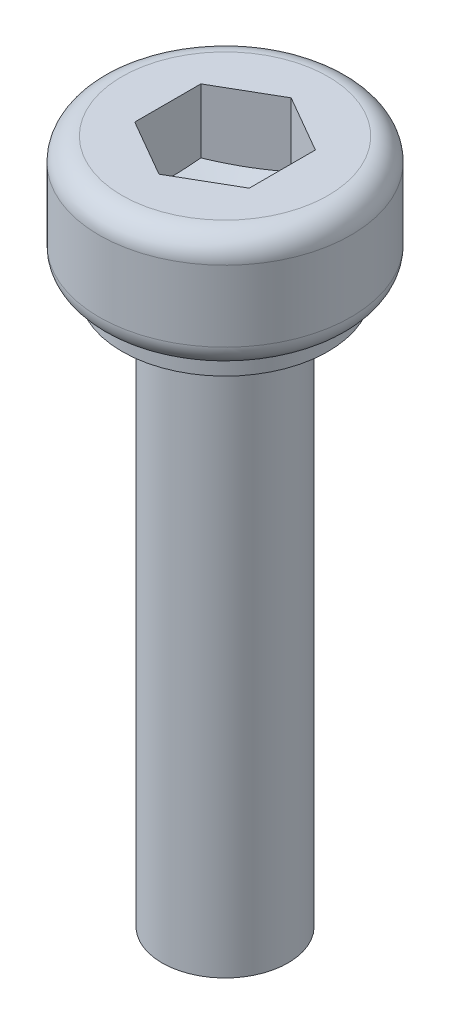
ISO-10303-21;
HEADER;
FILE_DESCRIPTION(('STEP AP214'),'2;1');
FILE_NAME('part.step','',(''),(''),'','','');
FILE_SCHEMA(('AUTOMOTIVE_DESIGN { 1 0 10303 214 1 1 1 1 }'));
ENDSEC;
DATA;
#1=APPLICATION_CONTEXT('core data for automotive mechanical design processes');
#2=APPLICATION_PROTOCOL_DEFINITION('international standard','automotive_design',2000,#1);
#3=PRODUCT_CONTEXT('',#1,'mechanical');
#4=PRODUCT('Part','Part','',(#3));
#5=PRODUCT_RELATED_PRODUCT_CATEGORY('part','',(#4));
#6=PRODUCT_DEFINITION_FORMATION('','',#4);
#7=PRODUCT_DEFINITION_CONTEXT('part definition',#1,'design');
#8=PRODUCT_DEFINITION('design','',#6,#7);
#9=PRODUCT_DEFINITION_SHAPE('','',#8);
#10=(LENGTH_UNIT() NAMED_UNIT(*) SI_UNIT(.MILLI.,.METRE.));
#11=(NAMED_UNIT(*) PLANE_ANGLE_UNIT() SI_UNIT($,.RADIAN.));
#12=(NAMED_UNIT(*) SI_UNIT($,.STERADIAN.) SOLID_ANGLE_UNIT());
#13=UNCERTAINTY_MEASURE_WITH_UNIT(LENGTH_MEASURE(1.E-05),#10,'distance_accuracy_value','');
#14=(GEOMETRIC_REPRESENTATION_CONTEXT(3) GLOBAL_UNCERTAINTY_ASSIGNED_CONTEXT((#13)) GLOBAL_UNIT_ASSIGNED_CONTEXT((#10,
#11,#12)) REPRESENTATION_CONTEXT('',''));
#15=CARTESIAN_POINT('',(0.,0.,0.));
#16=DIRECTION('',(0.,0.,1.));
#17=DIRECTION('',(1.,0.,0.));
#18=AXIS2_PLACEMENT_3D('',#15,#16,#17);
#19=CARTESIAN_POINT('',(0.,7.475,0.));
#20=DIRECTION('',(0.,-1.,0.));
#21=DIRECTION('',(0.,0.,-1.));
#22=AXIS2_PLACEMENT_3D('',#19,#20,#21);
#23=PLANE('',#22);
#24=DIRECTION('',(-0.866025403784439,0.,0.5));
#25=VECTOR('',#24,1.);
#26=CARTESIAN_POINT('',(0.,7.475,-1.44337567297406));
#27=LINE('',#26,#25);
#28=CARTESIAN_POINT('',(0.,7.475,-1.44337567297406));
#29=VERTEX_POINT('',#28);
#30=CARTESIAN_POINT('',(-1.25,7.475,-0.721687836487033));
#31=VERTEX_POINT('',#30);
#32=EDGE_CURVE('E215',#29,#31,#27,.T.);
#33=ORIENTED_EDGE('',*,*,#32,.F.);
#34=DIRECTION('',(-0.866025403784439,0.,-0.5));
#35=VECTOR('',#34,1.);
#36=CARTESIAN_POINT('',(1.25,7.475,-0.721687836487033));
#37=LINE('',#36,#35);
#38=CARTESIAN_POINT('',(1.25,7.475,-0.721687836487033));
#39=VERTEX_POINT('',#38);
#40=EDGE_CURVE('E64',#39,#29,#37,.T.);
#41=ORIENTED_EDGE('',*,*,#40,.F.);
#42=DIRECTION('',(0.,0.,-1.));
#43=VECTOR('',#42,1.);
#44=CARTESIAN_POINT('',(1.25,7.475,0.721687836487033));
#45=LINE('',#44,#43);
#46=CARTESIAN_POINT('',(1.25,7.475,0.721687836487033));
#47=VERTEX_POINT('',#46);
#48=EDGE_CURVE('E126',#47,#39,#45,.T.);
#49=ORIENTED_EDGE('',*,*,#48,.F.);
#50=DIRECTION('',(0.866025403784439,0.,-0.5));
#51=VECTOR('',#50,1.);
#52=CARTESIAN_POINT('',(0.,7.475,1.44337567297406));
#53=LINE('',#52,#51);
#54=CARTESIAN_POINT('',(0.,7.475,1.44337567297406));
#55=VERTEX_POINT('',#54);
#56=EDGE_CURVE('E133',#55,#47,#53,.T.);
#57=ORIENTED_EDGE('',*,*,#56,.F.);
#58=DIRECTION('',(0.866025403784439,0.,0.5));
#59=VECTOR('',#58,1.);
#60=CARTESIAN_POINT('',(-1.25,7.475,0.721687836487033));
#61=LINE('',#60,#59);
#62=CARTESIAN_POINT('',(-1.25,7.475,0.721687836487033));
#63=VERTEX_POINT('',#62);
#64=EDGE_CURVE('E392',#63,#55,#61,.T.);
#65=ORIENTED_EDGE('',*,*,#64,.F.);
#66=DIRECTION('',(0.,0.,1.));
#67=VECTOR('',#66,1.);
#68=CARTESIAN_POINT('',(-1.25,7.475,-0.721687836487033));
#69=LINE('',#68,#67);
#70=EDGE_CURVE('E406',#31,#63,#69,.T.);
#71=ORIENTED_EDGE('',*,*,#70,.F.);
#72=EDGE_LOOP('',(#33,#41,#49,#57,#65,#71));
#73=FACE_BOUND('',#72,.T.);
#74=CARTESIAN_POINT('',(0.,7.475,0.));
#75=DIRECTION('',(0.,1.,0.));
#76=DIRECTION('',(0.,0.,1.));
#77=AXIS2_PLACEMENT_3D('',#74,#75,#76);
#78=CIRCLE('',#77,2.25);
#79=CARTESIAN_POINT('',(0.,7.475,2.25));
#80=VERTEX_POINT('',#79);
#81=EDGE_CURVE('E11',#80,#80,#78,.T.);
#82=ORIENTED_EDGE('',*,*,#81,.T.);
#83=EDGE_LOOP('',(#82));
#84=FACE_BOUND('',#83,.T.);
#85=ADVANCED_FACE('F49',(#73,#84),#23,.F.);
#86=CARTESIAN_POINT('',(0.,6.975,0.));
#87=DIRECTION('',(0.,1.,0.));
#88=DIRECTION('',(0.,0.,1.));
#89=AXIS2_PLACEMENT_3D('',#86,#87,#88);
#90=TOROIDAL_SURFACE('',#89,2.25,0.5);
#91=ORIENTED_EDGE('',*,*,#81,.F.);
#92=EDGE_LOOP('',(#91));
#93=FACE_BOUND('',#92,.T.);
#94=CARTESIAN_POINT('',(0.,6.975,0.));
#95=DIRECTION('',(0.,1.,0.));
#96=DIRECTION('',(0.,0.,1.));
#97=AXIS2_PLACEMENT_3D('',#94,#95,#96);
#98=CIRCLE('',#97,2.75);
#99=CARTESIAN_POINT('',(0.,6.975,2.75));
#100=VERTEX_POINT('',#99);
#101=EDGE_CURVE('E57',#100,#100,#98,.T.);
#102=ORIENTED_EDGE('',*,*,#101,.T.);
#103=EDGE_LOOP('',(#102));
#104=FACE_BOUND('',#103,.T.);
#105=ADVANCED_FACE('F206',(#93,#104),#90,.T.);
#106=CARTESIAN_POINT('',(0.,4.09422492401216,0.));
#107=DIRECTION('',(0.,1.,0.));
#108=DIRECTION('',(0.,0.,1.));
#109=AXIS2_PLACEMENT_3D('',#106,#107,#108);
#110=CYLINDRICAL_SURFACE('',#109,2.75);
#111=ORIENTED_EDGE('',*,*,#101,.F.);
#112=EDGE_LOOP('',(#111));
#113=FACE_BOUND('',#112,.T.);
#114=CARTESIAN_POINT('',(0.,5.425,0.));
#115=DIRECTION('',(0.,1.,0.));
#116=DIRECTION('',(0.,0.,1.));
#117=AXIS2_PLACEMENT_3D('',#114,#115,#116);
#118=CIRCLE('',#117,2.75);
#119=CARTESIAN_POINT('',(0.,5.425,2.75));
#120=VERTEX_POINT('',#119);
#121=EDGE_CURVE('E222',#120,#120,#118,.T.);
#122=ORIENTED_EDGE('',*,*,#121,.T.);
#123=EDGE_LOOP('',(#122));
#124=FACE_BOUND('',#123,.T.);
#125=ADVANCED_FACE('F211',(#113,#124),#110,.T.);
#126=CARTESIAN_POINT('',(0.,5.425,0.));
#127=DIRECTION('',(0.,1.,0.));
#128=DIRECTION('',(0.,0.,1.));
#129=AXIS2_PLACEMENT_3D('',#126,#127,#128);
#130=TOROIDAL_SURFACE('',#129,2.25,0.5);
#131=ORIENTED_EDGE('',*,*,#121,.F.);
#132=EDGE_LOOP('',(#131));
#133=FACE_BOUND('',#132,.T.);
#134=CARTESIAN_POINT('',(0.,4.925,0.));
#135=DIRECTION('',(0.,1.,0.));
#136=DIRECTION('',(0.,0.,1.));
#137=AXIS2_PLACEMENT_3D('',#134,#135,#136);
#138=CIRCLE('',#137,2.25);
#139=CARTESIAN_POINT('',(0.,4.925,2.25));
#140=VERTEX_POINT('',#139);
#141=EDGE_CURVE('E225',#140,#140,#138,.T.);
#142=ORIENTED_EDGE('',*,*,#141,.T.);
#143=EDGE_LOOP('',(#142));
#144=FACE_BOUND('',#143,.T.);
#145=ADVANCED_FACE('F262',(#133,#144),#130,.T.);
#146=CARTESIAN_POINT('',(0.,4.09422492401216,0.));
#147=DIRECTION('',(0.,1.,0.));
#148=DIRECTION('',(0.,0.,1.));
#149=AXIS2_PLACEMENT_3D('',#146,#147,#148);
#150=CYLINDRICAL_SURFACE('',#149,2.25);
#151=ORIENTED_EDGE('',*,*,#141,.F.);
#152=EDGE_LOOP('',(#151));
#153=FACE_BOUND('',#152,.T.);
#154=CARTESIAN_POINT('',(0.,4.525,0.));
#155=DIRECTION('',(0.,1.,0.));
#156=DIRECTION('',(0.,0.,1.));
#157=AXIS2_PLACEMENT_3D('',#154,#155,#156);
#158=CIRCLE('',#157,2.25);
#159=CARTESIAN_POINT('',(0.,4.525,2.25));
#160=VERTEX_POINT('',#159);
#161=EDGE_CURVE('E231',#160,#160,#158,.T.);
#162=ORIENTED_EDGE('',*,*,#161,.T.);
#163=EDGE_LOOP('',(#162));
#164=FACE_BOUND('',#163,.T.);
#165=ADVANCED_FACE('F258',(#153,#164),#150,.T.);
#166=CARTESIAN_POINT('',(2.25,4.525,0.));
#167=DIRECTION('',(0.,1.,0.));
#168=DIRECTION('',(0.,0.,1.));
#169=AXIS2_PLACEMENT_3D('',#166,#167,#168);
#170=PLANE('',#169);
#171=ORIENTED_EDGE('',*,*,#161,.F.);
#172=EDGE_LOOP('',(#171));
#173=FACE_BOUND('',#172,.T.);
#174=CARTESIAN_POINT('',(0.,4.525,0.));
#175=DIRECTION('',(0.,1.,0.));
#176=DIRECTION('',(0.,0.,1.));
#177=AXIS2_PLACEMENT_3D('',#174,#175,#176);
#178=CIRCLE('',#177,1.375);
#179=CARTESIAN_POINT('',(0.,4.525,1.375));
#180=VERTEX_POINT('',#179);
#181=EDGE_CURVE('E234',#180,#180,#178,.T.);
#182=ORIENTED_EDGE('',*,*,#181,.T.);
#183=EDGE_LOOP('',(#182));
#184=FACE_BOUND('',#183,.T.);
#185=ADVANCED_FACE('F251',(#173,#184),#170,.F.);
#186=CARTESIAN_POINT('',(0.,4.09422492401216,0.));
#187=DIRECTION('',(0.,1.,0.));
#188=DIRECTION('',(0.,0.,1.));
#189=AXIS2_PLACEMENT_3D('',#186,#187,#188);
#190=CYLINDRICAL_SURFACE('',#189,1.375);
#191=ORIENTED_EDGE('',*,*,#181,.F.);
#192=EDGE_LOOP('',(#191));
#193=FACE_BOUND('',#192,.T.);
#194=CARTESIAN_POINT('',(0.,-7.475,0.));
#195=DIRECTION('',(0.,1.,0.));
#196=DIRECTION('',(0.,0.,1.));
#197=AXIS2_PLACEMENT_3D('',#194,#195,#196);
#198=CIRCLE('',#197,1.375);
#199=CARTESIAN_POINT('',(0.,-7.475,1.375));
#200=VERTEX_POINT('',#199);
#201=EDGE_CURVE('E112',#200,#200,#198,.T.);
#202=ORIENTED_EDGE('',*,*,#201,.T.);
#203=EDGE_LOOP('',(#202));
#204=FACE_BOUND('',#203,.T.);
#205=ADVANCED_FACE('F243',(#193,#204),#190,.T.);
#206=CARTESIAN_POINT('',(1.375,-7.475,0.));
#207=DIRECTION('',(0.,1.,0.));
#208=DIRECTION('',(0.,0.,1.));
#209=AXIS2_PLACEMENT_3D('',#206,#207,#208);
#210=PLANE('',#209);
#211=ORIENTED_EDGE('',*,*,#201,.F.);
#212=EDGE_LOOP('',(#211));
#213=FACE_BOUND('',#212,.T.);
#214=ADVANCED_FACE('F245',(#213),#210,.F.);
#215=CARTESIAN_POINT('',(1.25,5.475,-0.721687836487033));
#216=DIRECTION('',(0.5,0.,-0.866025403784439));
#217=DIRECTION('',(-0.866025403784439,0.,-0.5));
#218=AXIS2_PLACEMENT_3D('',#215,#216,#217);
#219=PLANE('',#218);
#220=CARTESIAN_POINT('',(-0.000199999999999668,6.07502213659224,-1.4434911430279));
#221=CARTESIAN_POINT('',(0.0518104295641314,6.06926246143579,-1.41346290751838));
#222=CARTESIAN_POINT('',(0.103869536937207,6.06403974723522,-1.38340656786277));
#223=CARTESIAN_POINT('',(0.208081999228772,6.05487120303171,-1.32323947470582));
#224=CARTESIAN_POINT('',(0.260235371100698,6.05092563186542,-1.29312871141642));
#225=CARTESIAN_POINT('',(0.364473709342653,6.0445253362828,-1.23294667877254));
#226=CARTESIAN_POINT('',(0.416558490077755,6.04206668415272,-1.20287551659445));
#227=CARTESIAN_POINT('',(0.520762183051685,6.03877043652459,-1.1427134864054));
#228=CARTESIAN_POINT('',(0.572881091525842,6.03793268513289,-1.11262262056797));
#229=CARTESIAN_POINT('',(0.677118908474158,6.03793268513289,-1.05244088889312));
#230=CARTESIAN_POINT('',(0.729237816948315,6.03877043652459,-1.0223500230557));
#231=CARTESIAN_POINT('',(0.833441509922245,6.04206668415272,-0.962187992866649));
#232=CARTESIAN_POINT('',(0.885526290657347,6.0445253362828,-0.932116830688555));
#233=CARTESIAN_POINT('',(0.989764628899302,6.05092563186542,-0.871934798044683));
#234=CARTESIAN_POINT('',(1.04191800077123,6.05487120303171,-0.84182403475528));
#235=CARTESIAN_POINT('',(1.14613046306279,6.06403974723522,-0.781656941598331));
#236=CARTESIAN_POINT('',(1.19818957043587,6.06926246143579,-0.751600601942714));
#237=CARTESIAN_POINT('',(1.2502,6.07502213659224,-0.721572366433195));
#238=B_SPLINE_CURVE_WITH_KNOTS('',3,(#220,#221,#222,#223,#224,#225,#226,#227,#228,#229,#230,
#231,#232,#233,#234,#235,#236,#237),.UNSPECIFIED.,.F.,.F.,(4,2,2,2,2,2,2,2,4),(0.,
0.181000745388271,0.362038150988405,0.542595231362164,0.723134945402974,0.903674659443784,
1.08423173981754,1.26526914541768,1.44626989080595),.UNSPECIFIED.);
#239=CARTESIAN_POINT('',(0.,6.075,-1.44337567297406));
#240=VERTEX_POINT('',#239);
#241=CARTESIAN_POINT('',(1.25,6.075,-0.721687836487033));
#242=VERTEX_POINT('',#241);
#243=EDGE_CURVE('E116',#240,#242,#238,.T.);
#244=ORIENTED_EDGE('',*,*,#243,.T.);
#245=DIRECTION('',(0.,1.,0.));
#246=VECTOR('',#245,1.);
#247=CARTESIAN_POINT('',(1.25,5.475,-0.721687836487033));
#248=LINE('',#247,#246);
#249=EDGE_CURVE('E113',#242,#39,#248,.T.);
#250=ORIENTED_EDGE('',*,*,#249,.T.);
#251=ORIENTED_EDGE('',*,*,#40,.T.);
#252=DIRECTION('',(0.,1.,0.));
#253=VECTOR('',#252,1.);
#254=CARTESIAN_POINT('',(0.,5.475,-1.44337567297406));
#255=LINE('',#254,#253);
#256=EDGE_CURVE('E107',#240,#29,#255,.T.);
#257=ORIENTED_EDGE('',*,*,#256,.F.);
#258=EDGE_LOOP('',(#244,#250,#251,#257));
#259=FACE_BOUND('',#258,.T.);
#260=ADVANCED_FACE('F124',(#259),#219,.F.);
#261=CARTESIAN_POINT('',(1.25,5.475,0.721687836487033));
#262=DIRECTION('',(1.,0.,0.));
#263=DIRECTION('',(0.,0.,-1.));
#264=AXIS2_PLACEMENT_3D('',#261,#262,#263);
#265=PLANE('',#264);
#266=CARTESIAN_POINT('',(1.25,6.27986393266067,-2.17905403611333));
#267=CARTESIAN_POINT('',(1.25,6.26241167422932,-2.07395009860659));
#268=CARTESIAN_POINT('',(1.25,6.24522032681984,-1.96879996781174));
#269=CARTESIAN_POINT('',(1.25,6.21170531820386,-1.75835059041696));
#270=CARTESIAN_POINT('',(1.25,6.1953817490476,-1.65305132920933));
#271=CARTESIAN_POINT('',(1.25,6.16387651632622,-1.44176294489903));
#272=CARTESIAN_POINT('',(1.25,6.14870071461258,-1.33577293769499));
#273=CARTESIAN_POINT('',(1.25,6.12016928542285,-1.12353979169023));
#274=CARTESIAN_POINT('',(1.25,6.10681373080936,-1.01729664292962));
#275=CARTESIAN_POINT('',(1.25,6.08296213919632,-0.806005172192662));
#276=CARTESIAN_POINT('',(1.25,6.0724282853726,-0.700961236680109));
#277=CARTESIAN_POINT('',(1.25,6.05508287381984,-0.490567790876244));
#278=CARTESIAN_POINT('',(1.25,6.04827077429862,-0.385218327307928));
#279=CARTESIAN_POINT('',(1.25,6.03946010519578,-0.17454649009671));
#280=CARTESIAN_POINT('',(1.25,6.03745059762555,-0.069224602200226));
#281=CARTESIAN_POINT('',(1.25,6.03861439807437,0.141392413524245));
#282=CARTESIAN_POINT('',(1.25,6.04178784167731,0.246687540580112));
#283=CARTESIAN_POINT('',(1.25,6.0511996283626,0.428094047279161));
#284=CARTESIAN_POINT('',(1.25,6.05635479919092,0.504266022940998));
#285=CARTESIAN_POINT('',(1.25,6.06864181101614,0.656446776567247));
#286=CARTESIAN_POINT('',(1.25,6.0757736272437,0.732455556564635));
#287=CARTESIAN_POINT('',(1.25,6.09949527042362,0.960485133272154));
#288=CARTESIAN_POINT('',(1.25,6.11839567377015,1.11226253619117));
#289=CARTESIAN_POINT('',(1.25,6.14949527165966,1.34036100724888));
#290=CARTESIAN_POINT('',(1.25,6.16038509955885,1.41687238761891));
#291=CARTESIAN_POINT('',(1.25,6.18286077200284,1.56979468542722));
#292=CARTESIAN_POINT('',(1.25,6.19444662073168,1.64620560225877));
#293=CARTESIAN_POINT('',(1.25,6.21810928108022,1.7987279380359));
#294=CARTESIAN_POINT('',(1.25,6.23018460256629,1.87483959068598));
#295=CARTESIAN_POINT('',(1.25,6.25474485969705,2.02699389967147));
#296=CARTESIAN_POINT('',(1.25,6.26722977968569,2.10303655853011));
#297=CARTESIAN_POINT('',(1.25,6.27986393266067,2.17905403611333));
#298=B_SPLINE_CURVE_WITH_KNOTS('',3,(#266,#267,#268,#269,#270,#271,#272,#273,#274,#275,#276,
#277,#278,#279,#280,#281,#282,#283,#284,#285,#286,#287,#288,#289,#290,#291,#292,#293,#294,#295,
#296,#297),.UNSPECIFIED.,.F.,.F.,(4,2,2,2,2,2,2,2,2,2,2,2,2,2,2,4),(0.,0.319633094293302,
0.639300026536295,0.960502494708345,1.28171781650624,1.59838422210634,1.91500451689018,
2.23090301324148,2.54680977350041,2.77582029179633,3.00482794049193,3.46358394927292,
3.69543178901939,3.92728102262634,4.15847082499727,4.38965180089788),.UNSPECIFIED.);
#299=CARTESIAN_POINT('',(1.25,6.075,0.721687836487033));
#300=VERTEX_POINT('',#299);
#301=EDGE_CURVE('E120',#242,#300,#298,.T.);
#302=ORIENTED_EDGE('',*,*,#301,.T.);
#303=DIRECTION('',(0.,1.,0.));
#304=VECTOR('',#303,1.);
#305=CARTESIAN_POINT('',(1.25,5.475,0.721687836487033));
#306=LINE('',#305,#304);
#307=EDGE_CURVE('E390',#300,#47,#306,.T.);
#308=ORIENTED_EDGE('',*,*,#307,.T.);
#309=ORIENTED_EDGE('',*,*,#48,.T.);
#310=ORIENTED_EDGE('',*,*,#249,.F.);
#311=EDGE_LOOP('',(#302,#308,#309,#310));
#312=FACE_BOUND('',#311,.T.);
#313=ADVANCED_FACE('F188',(#312),#265,.F.);
#314=CARTESIAN_POINT('',(0.,5.475,1.44337567297406));
#315=DIRECTION('',(0.5,0.,0.866025403784439));
#316=DIRECTION('',(0.866025403784439,0.,-0.5));
#317=AXIS2_PLACEMENT_3D('',#314,#315,#316);
#318=PLANE('',#317);
#319=CARTESIAN_POINT('',(1.2502,6.07502213659224,0.721572366433195));
#320=CARTESIAN_POINT('',(1.19818957043587,6.06926246143579,0.751600601942714));
#321=CARTESIAN_POINT('',(1.14613046306279,6.06403974723522,0.781656941598331));
#322=CARTESIAN_POINT('',(1.04191800077123,6.05487120303171,0.84182403475528));
#323=CARTESIAN_POINT('',(0.989764628899303,6.05092563186542,0.871934798044683));
#324=CARTESIAN_POINT('',(0.885526290657347,6.0445253362828,0.932116830688555));
#325=CARTESIAN_POINT('',(0.833441509922245,6.04206668415272,0.962187992866649));
#326=CARTESIAN_POINT('',(0.729237816948315,6.03877043652459,1.0223500230557));
#327=CARTESIAN_POINT('',(0.677118908474157,6.03793268513289,1.05244088889312));
#328=CARTESIAN_POINT('',(0.572881091525842,6.03793268513289,1.11262262056797));
#329=CARTESIAN_POINT('',(0.520762183051684,6.03877043652459,1.1427134864054));
#330=CARTESIAN_POINT('',(0.416558490077755,6.04206668415272,1.20287551659445));
#331=CARTESIAN_POINT('',(0.364473709342653,6.0445253362828,1.23294667877254));
#332=CARTESIAN_POINT('',(0.260235371100697,6.05092563186542,1.29312871141642));
#333=CARTESIAN_POINT('',(0.208081999228772,6.05487120303171,1.32323947470582));
#334=CARTESIAN_POINT('',(0.103869536937207,6.06403974723522,1.38340656786277));
#335=CARTESIAN_POINT('',(0.0518104295641311,6.06926246143579,1.41346290751838));
#336=CARTESIAN_POINT('',(-0.000200000000000036,6.07502213659224,1.4434911430279));
#337=B_SPLINE_CURVE_WITH_KNOTS('',3,(#319,#320,#321,#322,#323,#324,#325,#326,#327,#328,#329,
#330,#331,#332,#333,#334,#335,#336),.UNSPECIFIED.,.F.,.F.,(4,2,2,2,2,2,2,2,4),(0.,
0.181000745388271,0.362038150988405,0.542595231362164,0.723134945402974,0.903674659443784,
1.08423173981754,1.26526914541768,1.44626989080595),.UNSPECIFIED.);
#338=CARTESIAN_POINT('',(0.,6.075,1.44337567297406));
#339=VERTEX_POINT('',#338);
#340=EDGE_CURVE('E171',#300,#339,#337,.T.);
#341=ORIENTED_EDGE('',*,*,#340,.T.);
#342=DIRECTION('',(0.,1.,0.));
#343=VECTOR('',#342,1.);
#344=CARTESIAN_POINT('',(0.,5.475,1.44337567297406));
#345=LINE('',#344,#343);
#346=EDGE_CURVE('E388',#339,#55,#345,.T.);
#347=ORIENTED_EDGE('',*,*,#346,.T.);
#348=ORIENTED_EDGE('',*,*,#56,.T.);
#349=ORIENTED_EDGE('',*,*,#307,.F.);
#350=EDGE_LOOP('',(#341,#347,#348,#349));
#351=FACE_BOUND('',#350,.T.);
#352=ADVANCED_FACE('F191',(#351),#318,.F.);
#353=CARTESIAN_POINT('',(-1.25,5.475,0.721687836487033));
#354=DIRECTION('',(-0.5,0.,0.866025403784439));
#355=DIRECTION('',(0.866025403784439,0.,0.5));
#356=AXIS2_PLACEMENT_3D('',#353,#354,#355);
#357=PLANE('',#356);
#358=CARTESIAN_POINT('',(0.000199999999999786,6.07502213659224,1.4434911430279));
#359=CARTESIAN_POINT('',(-0.0518104295641313,6.06926246143579,1.41346290751838));
#360=CARTESIAN_POINT('',(-0.103869536937207,6.06403974723522,1.38340656786277));
#361=CARTESIAN_POINT('',(-0.208081999228772,6.05487120303171,1.32323947470582));
#362=CARTESIAN_POINT('',(-0.260235371100697,6.05092563186542,1.29312871141641));
#363=CARTESIAN_POINT('',(-0.364473709342653,6.0445253362828,1.23294667877254));
#364=CARTESIAN_POINT('',(-0.416558490077755,6.04206668415272,1.20287551659445));
#365=CARTESIAN_POINT('',(-0.520762183051685,6.03877043652459,1.1427134864054));
#366=CARTESIAN_POINT('',(-0.572881091525842,6.03793268513289,1.11262262056797));
#367=CARTESIAN_POINT('',(-0.677118908474158,6.03793268513289,1.05244088889312));
#368=CARTESIAN_POINT('',(-0.729237816948315,6.03877043652459,1.0223500230557));
#369=CARTESIAN_POINT('',(-0.833441509922245,6.04206668415272,0.962187992866648));
#370=CARTESIAN_POINT('',(-0.885526290657347,6.0445253362828,0.932116830688555));
#371=CARTESIAN_POINT('',(-0.989764628899303,6.05092563186542,0.871934798044682));
#372=CARTESIAN_POINT('',(-1.04191800077123,6.05487120303171,0.84182403475528));
#373=CARTESIAN_POINT('',(-1.14613046306279,6.06403974723522,0.781656941598331));
#374=CARTESIAN_POINT('',(-1.19818957043587,6.06926246143579,0.751600601942714));
#375=CARTESIAN_POINT('',(-1.2502,6.07502213659224,0.721572366433195));
#376=B_SPLINE_CURVE_WITH_KNOTS('',3,(#358,#359,#360,#361,#362,#363,#364,#365,#366,#367,#368,
#369,#370,#371,#372,#373,#374,#375),.UNSPECIFIED.,.F.,.F.,(4,2,2,2,2,2,2,2,4),(0.,
0.181000745388271,0.362038150988405,0.542595231362164,0.723134945402974,0.903674659443784,
1.08423173981754,1.26526914541768,1.44626989080595),.UNSPECIFIED.);
#377=CARTESIAN_POINT('',(-1.25,6.075,0.721687836487033));
#378=VERTEX_POINT('',#377);
#379=EDGE_CURVE('E164',#339,#378,#376,.T.);
#380=ORIENTED_EDGE('',*,*,#379,.T.);
#381=DIRECTION('',(0.,1.,0.));
#382=VECTOR('',#381,1.);
#383=CARTESIAN_POINT('',(-1.25,5.475,0.721687836487033));
#384=LINE('',#383,#382);
#385=EDGE_CURVE('E130',#378,#63,#384,.T.);
#386=ORIENTED_EDGE('',*,*,#385,.T.);
#387=ORIENTED_EDGE('',*,*,#64,.T.);
#388=ORIENTED_EDGE('',*,*,#346,.F.);
#389=EDGE_LOOP('',(#380,#386,#387,#388));
#390=FACE_BOUND('',#389,.T.);
#391=ADVANCED_FACE('F195',(#390),#357,.F.);
#392=CARTESIAN_POINT('',(-1.25,5.475,-0.721687836487033));
#393=DIRECTION('',(-1.,0.,0.));
#394=DIRECTION('',(0.,0.,1.));
#395=AXIS2_PLACEMENT_3D('',#392,#393,#394);
#396=PLANE('',#395);
#397=CARTESIAN_POINT('',(-1.25,6.27986393266067,2.17905403611333));
#398=CARTESIAN_POINT('',(-1.25,6.26241167422932,2.07395009860659));
#399=CARTESIAN_POINT('',(-1.25,6.24522032681984,1.96879996781174));
#400=CARTESIAN_POINT('',(-1.25,6.21170531820386,1.75835059041696));
#401=CARTESIAN_POINT('',(-1.25,6.1953817490476,1.65305132920933));
#402=CARTESIAN_POINT('',(-1.25,6.16387651632622,1.44176294489903));
#403=CARTESIAN_POINT('',(-1.25,6.14870071461258,1.33577293769499));
#404=CARTESIAN_POINT('',(-1.25,6.12016928542285,1.12353979169023));
#405=CARTESIAN_POINT('',(-1.25,6.10681373080936,1.01729664292962));
#406=CARTESIAN_POINT('',(-1.25,6.08296213919632,0.806005172192661));
#407=CARTESIAN_POINT('',(-1.25,6.0724282853726,0.700961236680109));
#408=CARTESIAN_POINT('',(-1.25,6.05508287381984,0.490567790876243));
#409=CARTESIAN_POINT('',(-1.25,6.04827077429862,0.385218327307928));
#410=CARTESIAN_POINT('',(-1.25,6.03946010519578,0.17454649009671));
#411=CARTESIAN_POINT('',(-1.25,6.03745059762555,0.0692246022002256));
#412=CARTESIAN_POINT('',(-1.25,6.03861439807437,-0.141392413524246));
#413=CARTESIAN_POINT('',(-1.25,6.04178784167731,-0.246687540580112));
#414=CARTESIAN_POINT('',(-1.25,6.0511996283626,-0.428094047279161));
#415=CARTESIAN_POINT('',(-1.25,6.05635479919092,-0.504266022940999));
#416=CARTESIAN_POINT('',(-1.25,6.06864181101614,-0.656446776567247));
#417=CARTESIAN_POINT('',(-1.25,6.0757736272437,-0.732455556564635));
#418=CARTESIAN_POINT('',(-1.25,6.09949527042362,-0.960485133272153));
#419=CARTESIAN_POINT('',(-1.25,6.11839567377015,-1.11226253619117));
#420=CARTESIAN_POINT('',(-1.25,6.14949527165966,-1.34036100724888));
#421=CARTESIAN_POINT('',(-1.25,6.16038509955885,-1.41687238761891));
#422=CARTESIAN_POINT('',(-1.25,6.18286077200284,-1.56979468542722));
#423=CARTESIAN_POINT('',(-1.25,6.19444662073168,-1.64620560225877));
#424=CARTESIAN_POINT('',(-1.25,6.21810928108022,-1.7987279380359));
#425=CARTESIAN_POINT('',(-1.25,6.23018460256629,-1.87483959068598));
#426=CARTESIAN_POINT('',(-1.25,6.25474485969705,-2.02699389967147));
#427=CARTESIAN_POINT('',(-1.25,6.26722977968569,-2.10303655853011));
#428=CARTESIAN_POINT('',(-1.25,6.27986393266067,-2.17905403611333));
#429=B_SPLINE_CURVE_WITH_KNOTS('',3,(#397,#398,#399,#400,#401,#402,#403,#404,#405,#406,#407,
#408,#409,#410,#411,#412,#413,#414,#415,#416,#417,#418,#419,#420,#421,#422,#423,#424,#425,#426,
#427,#428),.UNSPECIFIED.,.F.,.F.,(4,2,2,2,2,2,2,2,2,2,2,2,2,2,2,4),(0.,0.319633094293302,
0.639300026536295,0.960502494708344,1.28171781650624,1.59838422210634,1.91500451689018,
2.23090301324148,2.54680977350041,2.77582029179633,3.00482794049193,3.46358394927292,
3.69543178901939,3.92728102262634,4.15847082499726,4.38965180089787),.UNSPECIFIED.);
#430=CARTESIAN_POINT('',(-1.25,6.075,-0.721687836487033));
#431=VERTEX_POINT('',#430);
#432=EDGE_CURVE('E72',#378,#431,#429,.T.);
#433=ORIENTED_EDGE('',*,*,#432,.T.);
#434=DIRECTION('',(0.,1.,0.));
#435=VECTOR('',#434,1.);
#436=CARTESIAN_POINT('',(-1.25,5.475,-0.721687836487033));
#437=LINE('',#436,#435);
#438=EDGE_CURVE('E109',#431,#31,#437,.T.);
#439=ORIENTED_EDGE('',*,*,#438,.T.);
#440=ORIENTED_EDGE('',*,*,#70,.T.);
#441=ORIENTED_EDGE('',*,*,#385,.F.);
#442=EDGE_LOOP('',(#433,#439,#440,#441));
#443=FACE_BOUND('',#442,.T.);
#444=ADVANCED_FACE('F199',(#443),#396,.F.);
#445=CARTESIAN_POINT('',(0.,5.475,-1.44337567297406));
#446=DIRECTION('',(-0.5,0.,-0.866025403784439));
#447=DIRECTION('',(-0.866025403784439,0.,0.5));
#448=AXIS2_PLACEMENT_3D('',#445,#446,#447);
#449=PLANE('',#448);
#450=CARTESIAN_POINT('',(-1.2502,6.07502213659224,-0.721572366433195));
#451=CARTESIAN_POINT('',(-1.19818957043587,6.06926246143579,-0.751600601942714));
#452=CARTESIAN_POINT('',(-1.14613046306279,6.06403974723522,-0.781656941598331));
#453=CARTESIAN_POINT('',(-1.04191800077123,6.05487120303171,-0.84182403475528));
#454=CARTESIAN_POINT('',(-0.989764628899302,6.05092563186542,-0.871934798044683));
#455=CARTESIAN_POINT('',(-0.885526290657347,6.0445253362828,-0.932116830688555));
#456=CARTESIAN_POINT('',(-0.833441509922245,6.04206668415272,-0.962187992866649));
#457=CARTESIAN_POINT('',(-0.729237816948315,6.03877043652459,-1.0223500230557));
#458=CARTESIAN_POINT('',(-0.677118908474157,6.03793268513289,-1.05244088889312));
#459=CARTESIAN_POINT('',(-0.572881091525842,6.03793268513289,-1.11262262056797));
#460=CARTESIAN_POINT('',(-0.520762183051684,6.03877043652459,-1.1427134864054));
#461=CARTESIAN_POINT('',(-0.416558490077755,6.04206668415272,-1.20287551659445));
#462=CARTESIAN_POINT('',(-0.364473709342652,6.0445253362828,-1.23294667877254));
#463=CARTESIAN_POINT('',(-0.260235371100697,6.05092563186542,-1.29312871141642));
#464=CARTESIAN_POINT('',(-0.208081999228772,6.05487120303171,-1.32323947470582));
#465=CARTESIAN_POINT('',(-0.103869536937207,6.06403974723522,-1.38340656786277));
#466=CARTESIAN_POINT('',(-0.0518104295641308,6.06926246143579,-1.41346290751838));
#467=CARTESIAN_POINT('',(0.00020000000000046,6.07502213659224,-1.4434911430279));
#468=B_SPLINE_CURVE_WITH_KNOTS('',3,(#450,#451,#452,#453,#454,#455,#456,#457,#458,#459,#460,
#461,#462,#463,#464,#465,#466,#467),.UNSPECIFIED.,.F.,.F.,(4,2,2,2,2,2,2,2,4),(0.,
0.181000745388271,0.362038150988405,0.542595231362164,0.723134945402975,0.903674659443785,
1.08423173981754,1.26526914541768,1.44626989080595),.UNSPECIFIED.);
#469=EDGE_CURVE('E103',#431,#240,#468,.T.);
#470=ORIENTED_EDGE('',*,*,#469,.T.);
#471=ORIENTED_EDGE('',*,*,#256,.T.);
#472=ORIENTED_EDGE('',*,*,#32,.T.);
#473=ORIENTED_EDGE('',*,*,#438,.F.);
#474=EDGE_LOOP('',(#470,#471,#472,#473));
#475=FACE_BOUND('',#474,.T.);
#476=ADVANCED_FACE('F105',(#475),#449,.F.);
#477=CARTESIAN_POINT('',(0.,5.875,0.));
#478=DIRECTION('',(0.,1.,0.));
#479=DIRECTION('',(0.,0.,1.));
#480=AXIS2_PLACEMENT_3D('',#477,#478,#479);
#481=PLANE('',#480);
#482=CARTESIAN_POINT('',(0.,5.875,0.));
#483=DIRECTION('',(0.,-1.,0.));
#484=DIRECTION('',(0.,0.,-1.));
#485=AXIS2_PLACEMENT_3D('',#482,#483,#484);
#486=CIRCLE('',#485,0.4);
#487=CARTESIAN_POINT('',(0.,5.875,-0.4));
#488=VERTEX_POINT('',#487);
#489=EDGE_CURVE('E379',#488,#488,#486,.T.);
#490=ORIENTED_EDGE('',*,*,#489,.F.);
#491=EDGE_LOOP('',(#490));
#492=FACE_BOUND('',#491,.T.);
#493=ADVANCED_FACE('F150',(#492),#481,.T.);
#494=CARTESIAN_POINT('',(0.,6.075,0.));
#495=DIRECTION('',(0.,1.,0.));
#496=DIRECTION('',(0.,0.,1.));
#497=AXIS2_PLACEMENT_3D('',#494,#495,#496);
#498=CONICAL_SURFACE('',#497,1.44337567297406,1.38140809939809);
#499=ORIENTED_EDGE('',*,*,#243,.F.);
#500=ORIENTED_EDGE('',*,*,#469,.F.);
#501=ORIENTED_EDGE('',*,*,#432,.F.);
#502=ORIENTED_EDGE('',*,*,#379,.F.);
#503=ORIENTED_EDGE('',*,*,#340,.F.);
#504=ORIENTED_EDGE('',*,*,#301,.F.);
#505=EDGE_LOOP('',(#499,#500,#501,#502,#503,#504));
#506=FACE_BOUND('',#505,.T.);
#507=ORIENTED_EDGE('',*,*,#489,.T.);
#508=EDGE_LOOP('',(#507));
#509=FACE_BOUND('',#508,.T.);
#510=ADVANCED_FACE('F117',(#506,#509),#498,.F.);
#511=CLOSED_SHELL('',(#85,#105,#125,#145,#165,#185,#205,#214,#260,#313,#352,#391,#444,#476,#493,#510));
#512=MANIFOLD_SOLID_BREP('B2',#511);
#513=ADVANCED_BREP_SHAPE_REPRESENTATION('',(#18,#512),#14);
#514=SHAPE_DEFINITION_REPRESENTATION(#9,#513);
ENDSEC;
END-ISO-10303-21;
